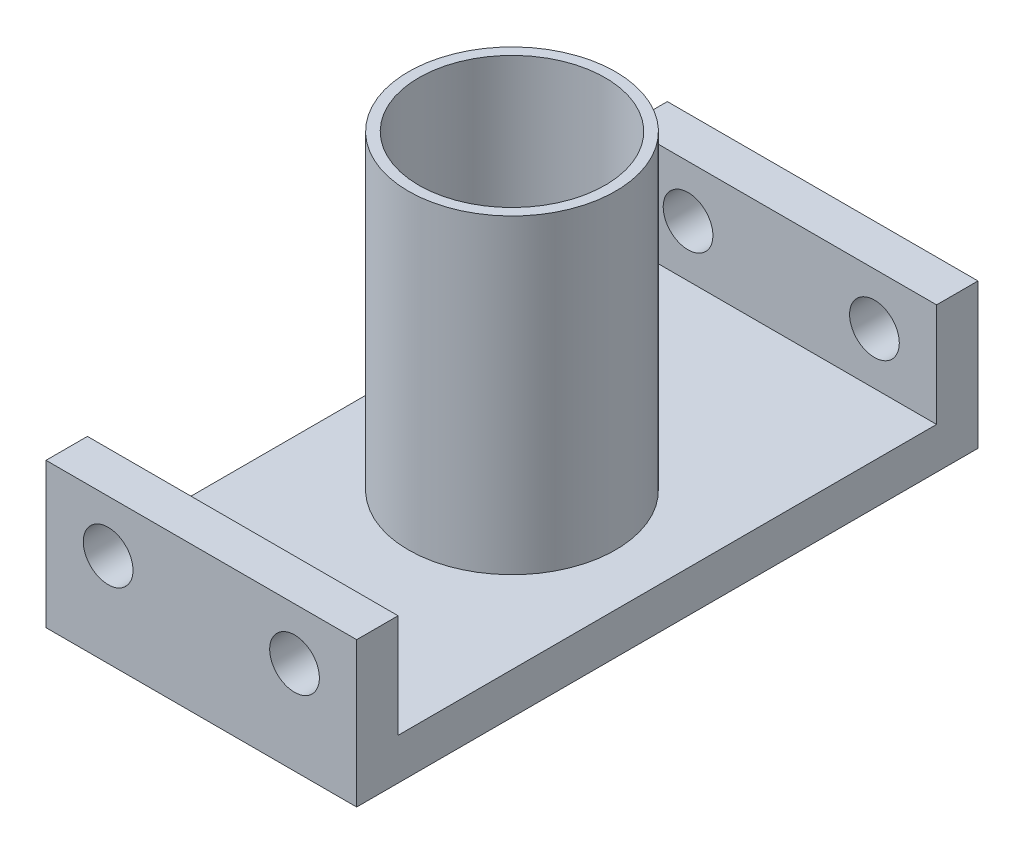
ISO-10303-21;
HEADER;
FILE_DESCRIPTION(('STEP AP214'),'2;1');
FILE_NAME('part.step','',(''),(''),'','','');
FILE_SCHEMA(('AUTOMOTIVE_DESIGN { 1 0 10303 214 1 1 1 1 }'));
ENDSEC;
DATA;
#1=APPLICATION_CONTEXT('core data for automotive mechanical design processes');
#2=APPLICATION_PROTOCOL_DEFINITION('international standard','automotive_design',2000,#1);
#3=PRODUCT_CONTEXT('',#1,'mechanical');
#4=PRODUCT('Part','Part','',(#3));
#5=PRODUCT_RELATED_PRODUCT_CATEGORY('part','',(#4));
#6=PRODUCT_DEFINITION_FORMATION('','',#4);
#7=PRODUCT_DEFINITION_CONTEXT('part definition',#1,'design');
#8=PRODUCT_DEFINITION('design','',#6,#7);
#9=PRODUCT_DEFINITION_SHAPE('','',#8);
#10=(LENGTH_UNIT() NAMED_UNIT(*) SI_UNIT(.MILLI.,.METRE.));
#11=(NAMED_UNIT(*) PLANE_ANGLE_UNIT() SI_UNIT($,.RADIAN.));
#12=(NAMED_UNIT(*) SI_UNIT($,.STERADIAN.) SOLID_ANGLE_UNIT());
#13=UNCERTAINTY_MEASURE_WITH_UNIT(LENGTH_MEASURE(1.E-05),#10,'distance_accuracy_value','');
#14=(GEOMETRIC_REPRESENTATION_CONTEXT(3) GLOBAL_UNCERTAINTY_ASSIGNED_CONTEXT((#13)) GLOBAL_UNIT_ASSIGNED_CONTEXT((#10,
#11,#12)) REPRESENTATION_CONTEXT('',''));
#15=CARTESIAN_POINT('',(0.,0.,0.));
#16=DIRECTION('',(0.,0.,1.));
#17=DIRECTION('',(1.,0.,0.));
#18=AXIS2_PLACEMENT_3D('',#15,#16,#17);
#19=CARTESIAN_POINT('',(0.,2.,0.));
#20=DIRECTION('',(0.,1.,0.));
#21=DIRECTION('',(0.,0.,1.));
#22=AXIS2_PLACEMENT_3D('',#19,#20,#21);
#23=PLANE('',#22);
#24=DIRECTION('',(0.,0.,1.));
#25=VECTOR('',#24,1.);
#26=CARTESIAN_POINT('',(-9.38554783581364,2.,-48.0983587776239));
#27=LINE('',#26,#25);
#28=CARTESIAN_POINT('',(-9.38554783581364,2.,-46.0983587776239));
#29=VERTEX_POINT('',#28);
#30=CARTESIAN_POINT('',(-9.38554783581364,2.,-20.0983587776239));
#31=VERTEX_POINT('',#30);
#32=EDGE_CURVE('E151',#29,#31,#27,.T.);
#33=ORIENTED_EDGE('',*,*,#32,.T.);
#34=DIRECTION('',(-1.,0.,0.));
#35=VECTOR('',#34,1.);
#36=CARTESIAN_POINT('',(-9.38554783581364,2.,-20.0983587776239));
#37=LINE('',#36,#35);
#38=CARTESIAN_POINT('',(5.61445216418636,2.,-20.0983587776239));
#39=VERTEX_POINT('',#38);
#40=EDGE_CURVE('E120',#39,#31,#37,.T.);
#41=ORIENTED_EDGE('',*,*,#40,.F.);
#42=DIRECTION('',(0.,0.,-1.));
#43=VECTOR('',#42,1.);
#44=CARTESIAN_POINT('',(5.61445216418636,2.,-48.0983587776239));
#45=LINE('',#44,#43);
#46=CARTESIAN_POINT('',(5.61445216418636,2.,-46.0983587776239));
#47=VERTEX_POINT('',#46);
#48=EDGE_CURVE('E161',#39,#47,#45,.T.);
#49=ORIENTED_EDGE('',*,*,#48,.T.);
#50=DIRECTION('',(1.,0.,0.));
#51=VECTOR('',#50,1.);
#52=CARTESIAN_POINT('',(-9.38554783581364,2.,-46.0983587776239));
#53=LINE('',#52,#51);
#54=EDGE_CURVE('E57',#29,#47,#53,.T.);
#55=ORIENTED_EDGE('',*,*,#54,.F.);
#56=EDGE_LOOP('',(#33,#41,#49,#55));
#57=FACE_BOUND('',#56,.T.);
#58=CARTESIAN_POINT('',(-1.88554783581364,2.,-33.0983587776239));
#59=DIRECTION('',(0.,1.,0.));
#60=DIRECTION('',(0.,0.,1.));
#61=AXIS2_PLACEMENT_3D('',#58,#59,#60);
#62=CIRCLE('',#61,5.);
#63=CARTESIAN_POINT('',(-1.88554783581364,2.,-28.0983587776239));
#64=VERTEX_POINT('',#63);
#65=EDGE_CURVE('E243',#64,#64,#62,.T.);
#66=ORIENTED_EDGE('',*,*,#65,.F.);
#67=EDGE_LOOP('',(#66));
#68=FACE_BOUND('',#67,.T.);
#69=ADVANCED_FACE('F32',(#57,#68),#23,.T.);
#70=CARTESIAN_POINT('',(-9.38554783581364,2.,-48.0983587776239));
#71=DIRECTION('',(1.,0.,0.));
#72=DIRECTION('',(0.,0.,-1.));
#73=AXIS2_PLACEMENT_3D('',#70,#71,#72);
#74=PLANE('',#73);
#75=DIRECTION('',(0.,0.,1.));
#76=VECTOR('',#75,1.);
#77=CARTESIAN_POINT('',(-9.38554783581364,0.,-48.0983587776239));
#78=LINE('',#77,#76);
#79=CARTESIAN_POINT('',(-9.38554783581364,0.,-48.0983587776239));
#80=VERTEX_POINT('',#79);
#81=CARTESIAN_POINT('',(-9.38554783581364,0.,-18.0983587776239));
#82=VERTEX_POINT('',#81);
#83=EDGE_CURVE('E107',#80,#82,#78,.T.);
#84=ORIENTED_EDGE('',*,*,#83,.T.);
#85=DIRECTION('',(0.,-1.,0.));
#86=VECTOR('',#85,1.);
#87=CARTESIAN_POINT('',(-9.38554783581364,2.,-18.0983587776239));
#88=LINE('',#87,#86);
#89=CARTESIAN_POINT('',(-9.38554783581364,7.,-18.0983587776239));
#90=VERTEX_POINT('',#89);
#91=EDGE_CURVE('E11',#90,#82,#88,.T.);
#92=ORIENTED_EDGE('',*,*,#91,.F.);
#93=DIRECTION('',(0.,0.,1.));
#94=VECTOR('',#93,1.);
#95=CARTESIAN_POINT('',(-9.38554783581364,7.,-18.0983587776239));
#96=LINE('',#95,#94);
#97=CARTESIAN_POINT('',(-9.38554783581364,7.,-20.0983587776239));
#98=VERTEX_POINT('',#97);
#99=EDGE_CURVE('E104',#98,#90,#96,.T.);
#100=ORIENTED_EDGE('',*,*,#99,.F.);
#101=DIRECTION('',(0.,-1.,0.));
#102=VECTOR('',#101,1.);
#103=CARTESIAN_POINT('',(-9.38554783581364,7.,-20.0983587776239));
#104=LINE('',#103,#102);
#105=EDGE_CURVE('E128',#98,#31,#104,.T.);
#106=ORIENTED_EDGE('',*,*,#105,.T.);
#107=ORIENTED_EDGE('',*,*,#32,.F.);
#108=DIRECTION('',(0.,-1.,0.));
#109=VECTOR('',#108,1.);
#110=CARTESIAN_POINT('',(-9.38554783581364,7.,-46.0983587776239));
#111=LINE('',#110,#109);
#112=CARTESIAN_POINT('',(-9.38554783581364,7.,-46.0983587776239));
#113=VERTEX_POINT('',#112);
#114=EDGE_CURVE('E154',#113,#29,#111,.T.);
#115=ORIENTED_EDGE('',*,*,#114,.F.);
#116=DIRECTION('',(0.,0.,1.));
#117=VECTOR('',#116,1.);
#118=CARTESIAN_POINT('',(-9.38554783581364,7.,-48.0983587776239));
#119=LINE('',#118,#117);
#120=CARTESIAN_POINT('',(-9.38554783581364,7.,-48.0983587776239));
#121=VERTEX_POINT('',#120);
#122=EDGE_CURVE('E132',#121,#113,#119,.T.);
#123=ORIENTED_EDGE('',*,*,#122,.F.);
#124=DIRECTION('',(0.,-1.,0.));
#125=VECTOR('',#124,1.);
#126=CARTESIAN_POINT('',(-9.38554783581364,2.,-48.0983587776239));
#127=LINE('',#126,#125);
#128=EDGE_CURVE('E162',#121,#80,#127,.T.);
#129=ORIENTED_EDGE('',*,*,#128,.T.);
#130=EDGE_LOOP('',(#84,#92,#100,#106,#107,#115,#123,#129));
#131=FACE_BOUND('',#130,.T.);
#132=ADVANCED_FACE('F34',(#131),#74,.F.);
#133=CARTESIAN_POINT('',(-9.38554783581364,2.,-18.0983587776239));
#134=DIRECTION('',(0.,0.,-1.));
#135=DIRECTION('',(-1.,0.,0.));
#136=AXIS2_PLACEMENT_3D('',#133,#134,#135);
#137=PLANE('',#136);
#138=CARTESIAN_POINT('',(-6.38554783581364,4.5,-18.0983587776239));
#139=DIRECTION('',(0.,0.,1.));
#140=DIRECTION('',(1.,0.,0.));
#141=AXIS2_PLACEMENT_3D('',#138,#139,#140);
#142=CIRCLE('',#141,1.19999999999999);
#143=CARTESIAN_POINT('',(-5.18554783581365,4.5,-18.0983587776239));
#144=VERTEX_POINT('',#143);
#145=EDGE_CURVE('E226',#144,#144,#142,.T.);
#146=ORIENTED_EDGE('',*,*,#145,.F.);
#147=EDGE_LOOP('',(#146));
#148=FACE_BOUND('',#147,.T.);
#149=CARTESIAN_POINT('',(2.61445216418636,4.5,-18.0983587776239));
#150=DIRECTION('',(0.,0.,1.));
#151=DIRECTION('',(1.,0.,0.));
#152=AXIS2_PLACEMENT_3D('',#149,#150,#151);
#153=CIRCLE('',#152,1.19999999999999);
#154=CARTESIAN_POINT('',(3.81445216418635,4.5,-18.0983587776239));
#155=VERTEX_POINT('',#154);
#156=EDGE_CURVE('E229',#155,#155,#153,.T.);
#157=ORIENTED_EDGE('',*,*,#156,.F.);
#158=EDGE_LOOP('',(#157));
#159=FACE_BOUND('',#158,.T.);
#160=DIRECTION('',(1.,0.,0.));
#161=VECTOR('',#160,1.);
#162=CARTESIAN_POINT('',(-9.38554783581364,0.,-18.0983587776239));
#163=LINE('',#162,#161);
#164=CARTESIAN_POINT('',(5.61445216418636,0.,-18.0983587776239));
#165=VERTEX_POINT('',#164);
#166=EDGE_CURVE('E167',#82,#165,#163,.T.);
#167=ORIENTED_EDGE('',*,*,#166,.T.);
#168=DIRECTION('',(0.,-1.,0.));
#169=VECTOR('',#168,1.);
#170=CARTESIAN_POINT('',(5.61445216418636,2.,-18.0983587776239));
#171=LINE('',#170,#169);
#172=CARTESIAN_POINT('',(5.61445216418636,7.,-18.0983587776239));
#173=VERTEX_POINT('',#172);
#174=EDGE_CURVE('E41',#173,#165,#171,.T.);
#175=ORIENTED_EDGE('',*,*,#174,.F.);
#176=DIRECTION('',(1.,0.,0.));
#177=VECTOR('',#176,1.);
#178=CARTESIAN_POINT('',(-9.38554783581364,7.,-18.0983587776239));
#179=LINE('',#178,#177);
#180=EDGE_CURVE('E110',#90,#173,#179,.T.);
#181=ORIENTED_EDGE('',*,*,#180,.F.);
#182=ORIENTED_EDGE('',*,*,#91,.T.);
#183=EDGE_LOOP('',(#167,#175,#181,#182));
#184=FACE_BOUND('',#183,.T.);
#185=ADVANCED_FACE('F111',(#148,#159,#184),#137,.F.);
#186=CARTESIAN_POINT('',(5.61445216418636,2.,-48.0983587776239));
#187=DIRECTION('',(-1.,0.,0.));
#188=DIRECTION('',(0.,0.,1.));
#189=AXIS2_PLACEMENT_3D('',#186,#187,#188);
#190=PLANE('',#189);
#191=DIRECTION('',(0.,0.,-1.));
#192=VECTOR('',#191,1.);
#193=CARTESIAN_POINT('',(5.61445216418636,0.,-48.0983587776239));
#194=LINE('',#193,#192);
#195=CARTESIAN_POINT('',(5.61445216418636,0.,-48.0983587776239));
#196=VERTEX_POINT('',#195);
#197=EDGE_CURVE('E169',#165,#196,#194,.T.);
#198=ORIENTED_EDGE('',*,*,#197,.T.);
#199=DIRECTION('',(0.,-1.,0.));
#200=VECTOR('',#199,1.);
#201=CARTESIAN_POINT('',(5.61445216418636,2.,-48.0983587776239));
#202=LINE('',#201,#200);
#203=CARTESIAN_POINT('',(5.61445216418636,7.,-48.0983587776239));
#204=VERTEX_POINT('',#203);
#205=EDGE_CURVE('E174',#204,#196,#202,.T.);
#206=ORIENTED_EDGE('',*,*,#205,.F.);
#207=DIRECTION('',(0.,0.,-1.));
#208=VECTOR('',#207,1.);
#209=CARTESIAN_POINT('',(5.61445216418636,7.,-48.0983587776239));
#210=LINE('',#209,#208);
#211=CARTESIAN_POINT('',(5.61445216418636,7.,-46.0983587776239));
#212=VERTEX_POINT('',#211);
#213=EDGE_CURVE('E137',#212,#204,#210,.T.);
#214=ORIENTED_EDGE('',*,*,#213,.F.);
#215=DIRECTION('',(0.,-1.,0.));
#216=VECTOR('',#215,1.);
#217=CARTESIAN_POINT('',(5.61445216418636,7.,-46.0983587776239));
#218=LINE('',#217,#216);
#219=EDGE_CURVE('E143',#212,#47,#218,.T.);
#220=ORIENTED_EDGE('',*,*,#219,.T.);
#221=ORIENTED_EDGE('',*,*,#48,.F.);
#222=DIRECTION('',(0.,-1.,0.));
#223=VECTOR('',#222,1.);
#224=CARTESIAN_POINT('',(5.61445216418636,7.,-20.0983587776239));
#225=LINE('',#224,#223);
#226=CARTESIAN_POINT('',(5.61445216418636,7.,-20.0983587776239));
#227=VERTEX_POINT('',#226);
#228=EDGE_CURVE('E49',#227,#39,#225,.T.);
#229=ORIENTED_EDGE('',*,*,#228,.F.);
#230=DIRECTION('',(0.,0.,-1.));
#231=VECTOR('',#230,1.);
#232=CARTESIAN_POINT('',(5.61445216418636,7.,-18.0983587776239));
#233=LINE('',#232,#231);
#234=EDGE_CURVE('E115',#173,#227,#233,.T.);
#235=ORIENTED_EDGE('',*,*,#234,.F.);
#236=ORIENTED_EDGE('',*,*,#174,.T.);
#237=EDGE_LOOP('',(#198,#206,#214,#220,#221,#229,#235,#236));
#238=FACE_BOUND('',#237,.T.);
#239=ADVANCED_FACE('F179',(#238),#190,.F.);
#240=CARTESIAN_POINT('',(-9.38554783581364,2.,-48.0983587776239));
#241=DIRECTION('',(0.,0.,1.));
#242=DIRECTION('',(1.,0.,0.));
#243=AXIS2_PLACEMENT_3D('',#240,#241,#242);
#244=PLANE('',#243);
#245=CARTESIAN_POINT('',(-6.38554783581364,4.5,-48.0983587776239));
#246=DIRECTION('',(0.,0.,1.));
#247=DIRECTION('',(1.,0.,0.));
#248=AXIS2_PLACEMENT_3D('',#245,#246,#247);
#249=CIRCLE('',#248,1.19999999999999);
#250=CARTESIAN_POINT('',(-5.18554783581364,4.5,-48.0983587776239));
#251=VERTEX_POINT('',#250);
#252=EDGE_CURVE('E238',#251,#251,#249,.T.);
#253=ORIENTED_EDGE('',*,*,#252,.T.);
#254=EDGE_LOOP('',(#253));
#255=FACE_BOUND('',#254,.T.);
#256=CARTESIAN_POINT('',(2.61445216418636,4.5,-48.0983587776239));
#257=DIRECTION('',(0.,0.,1.));
#258=DIRECTION('',(1.,0.,0.));
#259=AXIS2_PLACEMENT_3D('',#256,#257,#258);
#260=CIRCLE('',#259,1.19999999999999);
#261=CARTESIAN_POINT('',(3.81445216418636,4.5,-48.0983587776239));
#262=VERTEX_POINT('',#261);
#263=EDGE_CURVE('E231',#262,#262,#260,.T.);
#264=ORIENTED_EDGE('',*,*,#263,.T.);
#265=EDGE_LOOP('',(#264));
#266=FACE_BOUND('',#265,.T.);
#267=DIRECTION('',(-1.,0.,0.));
#268=VECTOR('',#267,1.);
#269=CARTESIAN_POINT('',(-9.38554783581364,0.,-48.0983587776239));
#270=LINE('',#269,#268);
#271=EDGE_CURVE('E171',#196,#80,#270,.T.);
#272=ORIENTED_EDGE('',*,*,#271,.T.);
#273=ORIENTED_EDGE('',*,*,#128,.F.);
#274=DIRECTION('',(-1.,0.,0.));
#275=VECTOR('',#274,1.);
#276=CARTESIAN_POINT('',(-9.38554783581364,7.,-48.0983587776239));
#277=LINE('',#276,#275);
#278=EDGE_CURVE('E140',#204,#121,#277,.T.);
#279=ORIENTED_EDGE('',*,*,#278,.F.);
#280=ORIENTED_EDGE('',*,*,#205,.T.);
#281=EDGE_LOOP('',(#272,#273,#279,#280));
#282=FACE_BOUND('',#281,.T.);
#283=ADVANCED_FACE('F184',(#255,#266,#282),#244,.F.);
#284=CARTESIAN_POINT('',(0.,0.,0.));
#285=DIRECTION('',(0.,1.,0.));
#286=DIRECTION('',(0.,0.,1.));
#287=AXIS2_PLACEMENT_3D('',#284,#285,#286);
#288=PLANE('',#287);
#289=CARTESIAN_POINT('',(-1.88554783581364,0.,-33.0983587776239));
#290=DIRECTION('',(0.,1.,0.));
#291=DIRECTION('',(0.,0.,1.));
#292=AXIS2_PLACEMENT_3D('',#289,#290,#291);
#293=CIRCLE('',#292,4.5);
#294=CARTESIAN_POINT('',(-1.88554783581364,0.,-28.598358777624));
#295=VERTEX_POINT('',#294);
#296=EDGE_CURVE('E246',#295,#295,#293,.T.);
#297=ORIENTED_EDGE('',*,*,#296,.T.);
#298=EDGE_LOOP('',(#297));
#299=FACE_BOUND('',#298,.T.);
#300=ORIENTED_EDGE('',*,*,#83,.F.);
#301=ORIENTED_EDGE('',*,*,#271,.F.);
#302=ORIENTED_EDGE('',*,*,#197,.F.);
#303=ORIENTED_EDGE('',*,*,#166,.F.);
#304=EDGE_LOOP('',(#300,#301,#302,#303));
#305=FACE_BOUND('',#304,.T.);
#306=ADVANCED_FACE('F182',(#299,#305),#288,.F.);
#307=CARTESIAN_POINT('',(-9.38554783581364,7.,-46.0983587776239));
#308=DIRECTION('',(0.,0.,-1.));
#309=DIRECTION('',(-1.,0.,0.));
#310=AXIS2_PLACEMENT_3D('',#307,#308,#309);
#311=PLANE('',#310);
#312=CARTESIAN_POINT('',(-6.38554783581364,4.5,-46.0983587776239));
#313=DIRECTION('',(0.,0.,-1.));
#314=DIRECTION('',(-1.,0.,0.));
#315=AXIS2_PLACEMENT_3D('',#312,#313,#314);
#316=CIRCLE('',#315,1.19999999999999);
#317=CARTESIAN_POINT('',(-7.58554783581363,4.5,-46.0983587776239));
#318=VERTEX_POINT('',#317);
#319=EDGE_CURVE('E36',#318,#318,#316,.T.);
#320=ORIENTED_EDGE('',*,*,#319,.T.);
#321=EDGE_LOOP('',(#320));
#322=FACE_BOUND('',#321,.T.);
#323=CARTESIAN_POINT('',(2.61445216418636,4.5,-46.0983587776239));
#324=DIRECTION('',(0.,0.,-1.));
#325=DIRECTION('',(-1.,0.,0.));
#326=AXIS2_PLACEMENT_3D('',#323,#324,#325);
#327=CIRCLE('',#326,1.19999999999999);
#328=CARTESIAN_POINT('',(1.41445216418637,4.5,-46.0983587776239));
#329=VERTEX_POINT('',#328);
#330=EDGE_CURVE('E122',#329,#329,#327,.T.);
#331=ORIENTED_EDGE('',*,*,#330,.T.);
#332=EDGE_LOOP('',(#331));
#333=FACE_BOUND('',#332,.T.);
#334=ORIENTED_EDGE('',*,*,#54,.T.);
#335=ORIENTED_EDGE('',*,*,#219,.F.);
#336=DIRECTION('',(1.,0.,0.));
#337=VECTOR('',#336,1.);
#338=CARTESIAN_POINT('',(-9.38554783581364,7.,-46.0983587776239));
#339=LINE('',#338,#337);
#340=EDGE_CURVE('E135',#113,#212,#339,.T.);
#341=ORIENTED_EDGE('',*,*,#340,.F.);
#342=ORIENTED_EDGE('',*,*,#114,.T.);
#343=EDGE_LOOP('',(#334,#335,#341,#342));
#344=FACE_BOUND('',#343,.T.);
#345=ADVANCED_FACE('F194',(#322,#333,#344),#311,.F.);
#346=CARTESIAN_POINT('',(0.,7.,0.));
#347=DIRECTION('',(0.,1.,0.));
#348=DIRECTION('',(0.,0.,1.));
#349=AXIS2_PLACEMENT_3D('',#346,#347,#348);
#350=PLANE('',#349);
#351=ORIENTED_EDGE('',*,*,#122,.T.);
#352=ORIENTED_EDGE('',*,*,#340,.T.);
#353=ORIENTED_EDGE('',*,*,#213,.T.);
#354=ORIENTED_EDGE('',*,*,#278,.T.);
#355=EDGE_LOOP('',(#351,#352,#353,#354));
#356=FACE_BOUND('',#355,.T.);
#357=ADVANCED_FACE('F189',(#356),#350,.T.);
#358=CARTESIAN_POINT('',(-9.38554783581364,7.,-20.0983587776239));
#359=DIRECTION('',(0.,0.,1.));
#360=DIRECTION('',(1.,0.,0.));
#361=AXIS2_PLACEMENT_3D('',#358,#359,#360);
#362=PLANE('',#361);
#363=CARTESIAN_POINT('',(-6.38554783581364,4.5,-20.0983587776239));
#364=DIRECTION('',(0.,0.,1.));
#365=DIRECTION('',(1.,0.,0.));
#366=AXIS2_PLACEMENT_3D('',#363,#364,#365);
#367=CIRCLE('',#366,1.19999999999999);
#368=CARTESIAN_POINT('',(-5.18554783581365,4.5,-20.0983587776239));
#369=VERTEX_POINT('',#368);
#370=EDGE_CURVE('E232',#369,#369,#367,.T.);
#371=ORIENTED_EDGE('',*,*,#370,.T.);
#372=EDGE_LOOP('',(#371));
#373=FACE_BOUND('',#372,.T.);
#374=CARTESIAN_POINT('',(2.61445216418636,4.5,-20.0983587776239));
#375=DIRECTION('',(0.,0.,1.));
#376=DIRECTION('',(1.,0.,0.));
#377=AXIS2_PLACEMENT_3D('',#374,#375,#376);
#378=CIRCLE('',#377,1.19999999999999);
#379=CARTESIAN_POINT('',(3.81445216418635,4.5,-20.0983587776239));
#380=VERTEX_POINT('',#379);
#381=EDGE_CURVE('E163',#380,#380,#378,.T.);
#382=ORIENTED_EDGE('',*,*,#381,.T.);
#383=EDGE_LOOP('',(#382));
#384=FACE_BOUND('',#383,.T.);
#385=ORIENTED_EDGE('',*,*,#40,.T.);
#386=ORIENTED_EDGE('',*,*,#105,.F.);
#387=DIRECTION('',(-1.,0.,0.));
#388=VECTOR('',#387,1.);
#389=CARTESIAN_POINT('',(-9.38554783581364,7.,-20.0983587776239));
#390=LINE('',#389,#388);
#391=EDGE_CURVE('E118',#227,#98,#390,.T.);
#392=ORIENTED_EDGE('',*,*,#391,.F.);
#393=ORIENTED_EDGE('',*,*,#228,.T.);
#394=EDGE_LOOP('',(#385,#386,#392,#393));
#395=FACE_BOUND('',#394,.T.);
#396=ADVANCED_FACE('F202',(#373,#384,#395),#362,.F.);
#397=CARTESIAN_POINT('',(0.,7.,0.));
#398=DIRECTION('',(0.,-1.,0.));
#399=DIRECTION('',(0.,0.,-1.));
#400=AXIS2_PLACEMENT_3D('',#397,#398,#399);
#401=PLANE('',#400);
#402=ORIENTED_EDGE('',*,*,#99,.T.);
#403=ORIENTED_EDGE('',*,*,#180,.T.);
#404=ORIENTED_EDGE('',*,*,#234,.T.);
#405=ORIENTED_EDGE('',*,*,#391,.T.);
#406=EDGE_LOOP('',(#402,#403,#404,#405));
#407=FACE_BOUND('',#406,.T.);
#408=ADVANCED_FACE('F117',(#407),#401,.F.);
#409=CARTESIAN_POINT('',(2.61445216418636,4.5,-18.0983587776239));
#410=DIRECTION('',(0.,0.,1.));
#411=DIRECTION('',(1.,0.,0.));
#412=AXIS2_PLACEMENT_3D('',#409,#410,#411);
#413=CYLINDRICAL_SURFACE('',#412,1.19999999999999);
#414=ORIENTED_EDGE('',*,*,#156,.T.);
#415=EDGE_LOOP('',(#414));
#416=FACE_BOUND('',#415,.T.);
#417=ORIENTED_EDGE('',*,*,#381,.F.);
#418=EDGE_LOOP('',(#417));
#419=FACE_BOUND('',#418,.T.);
#420=ADVANCED_FACE('F283',(#416,#419),#413,.F.);
#421=ORIENTED_EDGE('',*,*,#263,.F.);
#422=EDGE_LOOP('',(#421));
#423=FACE_BOUND('',#422,.T.);
#424=ORIENTED_EDGE('',*,*,#330,.F.);
#425=EDGE_LOOP('',(#424));
#426=FACE_BOUND('',#425,.T.);
#427=ADVANCED_FACE('F280',(#423,#426),#413,.F.);
#428=CARTESIAN_POINT('',(-6.38554783581364,4.5,-18.0983587776239));
#429=DIRECTION('',(0.,0.,1.));
#430=DIRECTION('',(1.,0.,0.));
#431=AXIS2_PLACEMENT_3D('',#428,#429,#430);
#432=CYLINDRICAL_SURFACE('',#431,1.19999999999999);
#433=ORIENTED_EDGE('',*,*,#252,.F.);
#434=EDGE_LOOP('',(#433));
#435=FACE_BOUND('',#434,.T.);
#436=ORIENTED_EDGE('',*,*,#319,.F.);
#437=EDGE_LOOP('',(#436));
#438=FACE_BOUND('',#437,.T.);
#439=ADVANCED_FACE('F276',(#435,#438),#432,.F.);
#440=ORIENTED_EDGE('',*,*,#145,.T.);
#441=EDGE_LOOP('',(#440));
#442=FACE_BOUND('',#441,.T.);
#443=ORIENTED_EDGE('',*,*,#370,.F.);
#444=EDGE_LOOP('',(#443));
#445=FACE_BOUND('',#444,.T.);
#446=ADVANCED_FACE('F270',(#442,#445),#432,.F.);
#447=CARTESIAN_POINT('',(-1.88554783581364,17.,-33.0983587776239));
#448=DIRECTION('',(0.,-1.,0.));
#449=DIRECTION('',(0.,0.,-1.));
#450=AXIS2_PLACEMENT_3D('',#447,#448,#449);
#451=CYLINDRICAL_SURFACE('',#450,5.);
#452=CARTESIAN_POINT('',(-1.88554783581364,17.,-33.0983587776239));
#453=DIRECTION('',(0.,1.,0.));
#454=DIRECTION('',(0.,0.,1.));
#455=AXIS2_PLACEMENT_3D('',#452,#453,#454);
#456=CIRCLE('',#455,5.);
#457=CARTESIAN_POINT('',(-1.88554783581364,17.,-28.0983587776239));
#458=VERTEX_POINT('',#457);
#459=EDGE_CURVE('E242',#458,#458,#456,.T.);
#460=ORIENTED_EDGE('',*,*,#459,.F.);
#461=EDGE_LOOP('',(#460));
#462=FACE_BOUND('',#461,.T.);
#463=ORIENTED_EDGE('',*,*,#65,.T.);
#464=EDGE_LOOP('',(#463));
#465=FACE_BOUND('',#464,.T.);
#466=ADVANCED_FACE('F264',(#462,#465),#451,.T.);
#467=CARTESIAN_POINT('',(-1.88554783581364,17.,-33.0983587776239));
#468=DIRECTION('',(0.,1.,0.));
#469=DIRECTION('',(0.,0.,1.));
#470=AXIS2_PLACEMENT_3D('',#467,#468,#469);
#471=PLANE('',#470);
#472=CARTESIAN_POINT('',(-1.88554783581364,17.,-33.0983587776239));
#473=DIRECTION('',(0.,1.,0.));
#474=DIRECTION('',(0.,0.,1.));
#475=AXIS2_PLACEMENT_3D('',#472,#473,#474);
#476=CIRCLE('',#475,4.5);
#477=CARTESIAN_POINT('',(-1.88554783581364,17.,-28.598358777624));
#478=VERTEX_POINT('',#477);
#479=EDGE_CURVE('E249',#478,#478,#476,.T.);
#480=ORIENTED_EDGE('',*,*,#479,.F.);
#481=EDGE_LOOP('',(#480));
#482=FACE_BOUND('',#481,.T.);
#483=ORIENTED_EDGE('',*,*,#459,.T.);
#484=EDGE_LOOP('',(#483));
#485=FACE_BOUND('',#484,.T.);
#486=ADVANCED_FACE('F258',(#482,#485),#471,.T.);
#487=CARTESIAN_POINT('',(-1.88554783581364,0.,-33.0983587776239));
#488=DIRECTION('',(0.,1.,0.));
#489=DIRECTION('',(0.,0.,1.));
#490=AXIS2_PLACEMENT_3D('',#487,#488,#489);
#491=CYLINDRICAL_SURFACE('',#490,4.5);
#492=ORIENTED_EDGE('',*,*,#296,.F.);
#493=EDGE_LOOP('',(#492));
#494=FACE_BOUND('',#493,.T.);
#495=ORIENTED_EDGE('',*,*,#479,.T.);
#496=EDGE_LOOP('',(#495));
#497=FACE_BOUND('',#496,.T.);
#498=ADVANCED_FACE('F255',(#494,#497),#491,.F.);
#499=CLOSED_SHELL('',(#69,#132,#185,#239,#283,#306,#345,#357,#396,#408,#420,#427,#439,#446,#466,
#486,#498));
#500=MANIFOLD_SOLID_BREP('B2',#499);
#501=ADVANCED_BREP_SHAPE_REPRESENTATION('',(#18,#500),#14);
#502=SHAPE_DEFINITION_REPRESENTATION(#9,#501);
ENDSEC;
END-ISO-10303-21;
